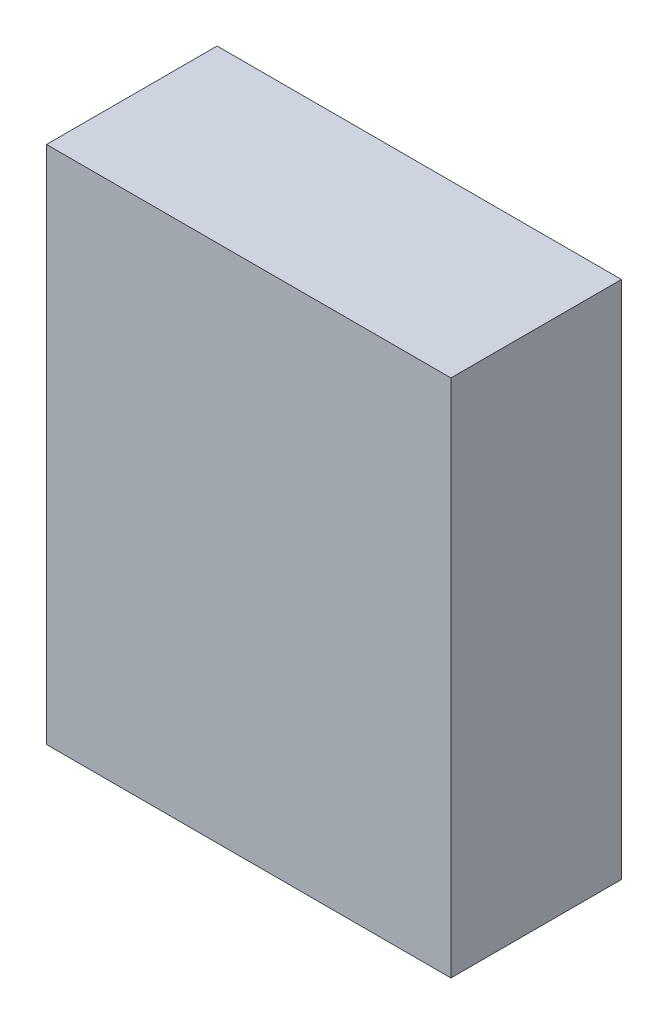
ISO-10303-21;
HEADER;
FILE_DESCRIPTION(('STEP AP214'),'2;1');
FILE_NAME('part.step','',(''),(''),'','','');
FILE_SCHEMA(('AUTOMOTIVE_DESIGN { 1 0 10303 214 1 1 1 1 }'));
ENDSEC;
DATA;
#1=APPLICATION_CONTEXT('core data for automotive mechanical design processes');
#2=APPLICATION_PROTOCOL_DEFINITION('international standard','automotive_design',2000,#1);
#3=PRODUCT_CONTEXT('',#1,'mechanical');
#4=PRODUCT('Part','Part','',(#3));
#5=PRODUCT_RELATED_PRODUCT_CATEGORY('part','',(#4));
#6=PRODUCT_DEFINITION_FORMATION('','',#4);
#7=PRODUCT_DEFINITION_CONTEXT('part definition',#1,'design');
#8=PRODUCT_DEFINITION('design','',#6,#7);
#9=PRODUCT_DEFINITION_SHAPE('','',#8);
#10=(LENGTH_UNIT() NAMED_UNIT(*) SI_UNIT(.MILLI.,.METRE.));
#11=(NAMED_UNIT(*) PLANE_ANGLE_UNIT() SI_UNIT($,.RADIAN.));
#12=(NAMED_UNIT(*) SI_UNIT($,.STERADIAN.) SOLID_ANGLE_UNIT());
#13=UNCERTAINTY_MEASURE_WITH_UNIT(LENGTH_MEASURE(1.E-05),#10,'distance_accuracy_value','');
#14=(GEOMETRIC_REPRESENTATION_CONTEXT(3) GLOBAL_UNCERTAINTY_ASSIGNED_CONTEXT((#13)) GLOBAL_UNIT_ASSIGNED_CONTEXT((#10,
#11,#12)) REPRESENTATION_CONTEXT('',''));
#15=CARTESIAN_POINT('',(0.,0.,0.));
#16=DIRECTION('',(0.,0.,1.));
#17=DIRECTION('',(1.,0.,0.));
#18=AXIS2_PLACEMENT_3D('',#15,#16,#17);
#19=CARTESIAN_POINT('',(1.24496576,1.5999968,1.05000044));
#20=DIRECTION('',(0.,0.,-1.));
#21=DIRECTION('',(-1.,0.,0.));
#22=AXIS2_PLACEMENT_3D('',#19,#20,#21);
#23=PLANE('',#22);
#24=DIRECTION('',(0.,1.,0.));
#25=VECTOR('',#24,1.);
#26=CARTESIAN_POINT('',(-1.24496576,1.5999968,1.05000044));
#27=LINE('',#26,#25);
#28=CARTESIAN_POINT('',(-1.24496576,1.5999968,1.05000044));
#29=VERTEX_POINT('',#28);
#30=CARTESIAN_POINT('',(-1.24496576,-1.5999968,1.05000044));
#31=VERTEX_POINT('',#30);
#32=EDGE_CURVE('E54',#29,#31,#27,.F.);
#33=ORIENTED_EDGE('',*,*,#32,.T.);
#34=DIRECTION('',(1.,0.,0.));
#35=VECTOR('',#34,1.);
#36=CARTESIAN_POINT('',(-1.24496576,-1.5999968,1.05000044));
#37=LINE('',#36,#35);
#38=CARTESIAN_POINT('',(1.24496576,-1.5999968,1.05000044));
#39=VERTEX_POINT('',#38);
#40=EDGE_CURVE('E56',#31,#39,#37,.T.);
#41=ORIENTED_EDGE('',*,*,#40,.T.);
#42=DIRECTION('',(0.,1.,0.));
#43=VECTOR('',#42,1.);
#44=CARTESIAN_POINT('',(1.24496576,-1.5999968,1.05000044));
#45=LINE('',#44,#43);
#46=CARTESIAN_POINT('',(1.24496576,1.5999968,1.05000044));
#47=VERTEX_POINT('',#46);
#48=EDGE_CURVE('E19',#39,#47,#45,.T.);
#49=ORIENTED_EDGE('',*,*,#48,.T.);
#50=DIRECTION('',(1.,0.,0.));
#51=VECTOR('',#50,1.);
#52=CARTESIAN_POINT('',(1.24496576,1.5999968,1.05000044));
#53=LINE('',#52,#51);
#54=EDGE_CURVE('E79',#47,#29,#53,.F.);
#55=ORIENTED_EDGE('',*,*,#54,.T.);
#56=EDGE_LOOP('',(#33,#41,#49,#55));
#57=FACE_BOUND('',#56,.T.);
#58=ADVANCED_FACE('F16',(#57),#23,.F.);
#59=CARTESIAN_POINT('',(1.24496576,-1.5999968,0.));
#60=DIRECTION('',(-1.,0.,0.));
#61=DIRECTION('',(0.,0.,1.));
#62=AXIS2_PLACEMENT_3D('',#59,#60,#61);
#63=PLANE('',#62);
#64=DIRECTION('',(0.,0.,-1.));
#65=VECTOR('',#64,1.);
#66=CARTESIAN_POINT('',(1.24496576,1.5999968,0.));
#67=LINE('',#66,#65);
#68=CARTESIAN_POINT('',(1.24496576,1.5999968,0.));
#69=VERTEX_POINT('',#68);
#70=EDGE_CURVE('E67',#69,#47,#67,.F.);
#71=ORIENTED_EDGE('',*,*,#70,.T.);
#72=ORIENTED_EDGE('',*,*,#48,.F.);
#73=DIRECTION('',(0.,0.,1.));
#74=VECTOR('',#73,1.);
#75=CARTESIAN_POINT('',(1.24496576,-1.5999968,0.));
#76=LINE('',#75,#74);
#77=CARTESIAN_POINT('',(1.24496576,-1.5999968,0.));
#78=VERTEX_POINT('',#77);
#79=EDGE_CURVE('E62',#39,#78,#76,.F.);
#80=ORIENTED_EDGE('',*,*,#79,.T.);
#81=DIRECTION('',(0.,1.,0.));
#82=VECTOR('',#81,1.);
#83=CARTESIAN_POINT('',(1.24496576,1.5999968,0.));
#84=LINE('',#83,#82);
#85=EDGE_CURVE('E82',#69,#78,#84,.F.);
#86=ORIENTED_EDGE('',*,*,#85,.F.);
#87=EDGE_LOOP('',(#71,#72,#80,#86));
#88=FACE_BOUND('',#87,.T.);
#89=ADVANCED_FACE('F64',(#88),#63,.F.);
#90=CARTESIAN_POINT('',(-1.24496576,-1.5999968,0.));
#91=DIRECTION('',(0.,1.,0.));
#92=DIRECTION('',(0.,0.,1.));
#93=AXIS2_PLACEMENT_3D('',#90,#91,#92);
#94=PLANE('',#93);
#95=ORIENTED_EDGE('',*,*,#79,.F.);
#96=ORIENTED_EDGE('',*,*,#40,.F.);
#97=DIRECTION('',(0.,0.,-1.));
#98=VECTOR('',#97,1.);
#99=CARTESIAN_POINT('',(-1.24496576,-1.5999968,0.));
#100=LINE('',#99,#98);
#101=CARTESIAN_POINT('',(-1.24496576,-1.5999968,0.));
#102=VERTEX_POINT('',#101);
#103=EDGE_CURVE('E74',#31,#102,#100,.T.);
#104=ORIENTED_EDGE('',*,*,#103,.T.);
#105=DIRECTION('',(-1.,0.,0.));
#106=VECTOR('',#105,1.);
#107=CARTESIAN_POINT('',(1.24496576,-1.5999968,0.));
#108=LINE('',#107,#106);
#109=EDGE_CURVE('E71',#78,#102,#108,.T.);
#110=ORIENTED_EDGE('',*,*,#109,.F.);
#111=EDGE_LOOP('',(#95,#96,#104,#110));
#112=FACE_BOUND('',#111,.T.);
#113=ADVANCED_FACE('F69',(#112),#94,.F.);
#114=CARTESIAN_POINT('',(-1.24496576,1.5999968,0.));
#115=DIRECTION('',(1.,0.,0.));
#116=DIRECTION('',(0.,0.,-1.));
#117=AXIS2_PLACEMENT_3D('',#114,#115,#116);
#118=PLANE('',#117);
#119=ORIENTED_EDGE('',*,*,#103,.F.);
#120=ORIENTED_EDGE('',*,*,#32,.F.);
#121=DIRECTION('',(0.,0.,-1.));
#122=VECTOR('',#121,1.);
#123=CARTESIAN_POINT('',(-1.24496576,1.5999968,0.));
#124=LINE('',#123,#122);
#125=CARTESIAN_POINT('',(-1.24496576,1.5999968,0.));
#126=VERTEX_POINT('',#125);
#127=EDGE_CURVE('E34',#29,#126,#124,.T.);
#128=ORIENTED_EDGE('',*,*,#127,.T.);
#129=DIRECTION('',(0.,1.,0.));
#130=VECTOR('',#129,1.);
#131=CARTESIAN_POINT('',(-1.24496576,1.5999968,0.));
#132=LINE('',#131,#130);
#133=EDGE_CURVE('E25',#102,#126,#132,.T.);
#134=ORIENTED_EDGE('',*,*,#133,.F.);
#135=EDGE_LOOP('',(#119,#120,#128,#134));
#136=FACE_BOUND('',#135,.T.);
#137=ADVANCED_FACE('F88',(#136),#118,.F.);
#138=CARTESIAN_POINT('',(1.24496576,1.5999968,0.));
#139=DIRECTION('',(0.,-1.,0.));
#140=DIRECTION('',(0.,0.,-1.));
#141=AXIS2_PLACEMENT_3D('',#138,#139,#140);
#142=PLANE('',#141);
#143=ORIENTED_EDGE('',*,*,#127,.F.);
#144=ORIENTED_EDGE('',*,*,#54,.F.);
#145=ORIENTED_EDGE('',*,*,#70,.F.);
#146=DIRECTION('',(-1.,0.,0.));
#147=VECTOR('',#146,1.);
#148=CARTESIAN_POINT('',(1.24496576,1.5999968,0.));
#149=LINE('',#148,#147);
#150=EDGE_CURVE('E11',#126,#69,#149,.F.);
#151=ORIENTED_EDGE('',*,*,#150,.F.);
#152=EDGE_LOOP('',(#143,#144,#145,#151));
#153=FACE_BOUND('',#152,.T.);
#154=ADVANCED_FACE('F90',(#153),#142,.F.);
#155=CARTESIAN_POINT('',(1.24496576,1.5999968,0.));
#156=DIRECTION('',(0.,0.,-1.));
#157=DIRECTION('',(-1.,0.,0.));
#158=AXIS2_PLACEMENT_3D('',#155,#156,#157);
#159=PLANE('',#158);
#160=ORIENTED_EDGE('',*,*,#133,.T.);
#161=ORIENTED_EDGE('',*,*,#150,.T.);
#162=ORIENTED_EDGE('',*,*,#85,.T.);
#163=ORIENTED_EDGE('',*,*,#109,.T.);
#164=EDGE_LOOP('',(#160,#161,#162,#163));
#165=FACE_BOUND('',#164,.T.);
#166=ADVANCED_FACE('F87',(#165),#159,.T.);
#167=CLOSED_SHELL('',(#58,#89,#113,#137,#154,#166));
#168=MANIFOLD_SOLID_BREP('B1',#167);
#169=ADVANCED_BREP_SHAPE_REPRESENTATION('',(#18,#168),#14);
#170=SHAPE_DEFINITION_REPRESENTATION(#9,#169);
ENDSEC;
END-ISO-10303-21;
